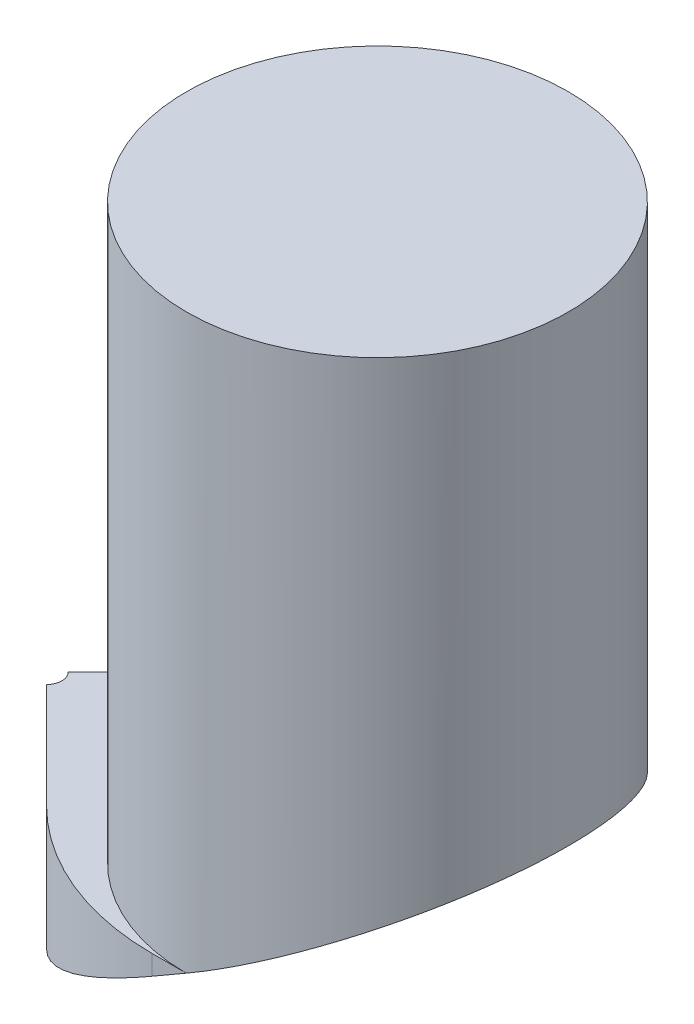
ISO-10303-21;
HEADER;
FILE_DESCRIPTION(('STEP AP214'),'2;1');
FILE_NAME('part.step','',(''),(''),'','','');
FILE_SCHEMA(('AUTOMOTIVE_DESIGN { 1 0 10303 214 1 1 1 1 }'));
ENDSEC;
DATA;
#1=APPLICATION_CONTEXT('core data for automotive mechanical design processes');
#2=APPLICATION_PROTOCOL_DEFINITION('international standard','automotive_design',2000,#1);
#3=PRODUCT_CONTEXT('',#1,'mechanical');
#4=PRODUCT('Part','Part','',(#3));
#5=PRODUCT_RELATED_PRODUCT_CATEGORY('part','',(#4));
#6=PRODUCT_DEFINITION_FORMATION('','',#4);
#7=PRODUCT_DEFINITION_CONTEXT('part definition',#1,'design');
#8=PRODUCT_DEFINITION('design','',#6,#7);
#9=PRODUCT_DEFINITION_SHAPE('','',#8);
#10=(LENGTH_UNIT() NAMED_UNIT(*) SI_UNIT(.MILLI.,.METRE.));
#11=(NAMED_UNIT(*) PLANE_ANGLE_UNIT() SI_UNIT($,.RADIAN.));
#12=(NAMED_UNIT(*) SI_UNIT($,.STERADIAN.) SOLID_ANGLE_UNIT());
#13=UNCERTAINTY_MEASURE_WITH_UNIT(LENGTH_MEASURE(1.E-05),#10,'distance_accuracy_value','');
#14=(GEOMETRIC_REPRESENTATION_CONTEXT(3) GLOBAL_UNCERTAINTY_ASSIGNED_CONTEXT((#13)) GLOBAL_UNIT_ASSIGNED_CONTEXT((#10,
#11,#12)) REPRESENTATION_CONTEXT('',''));
#15=CARTESIAN_POINT('',(0.,0.,0.));
#16=DIRECTION('',(0.,0.,1.));
#17=DIRECTION('',(1.,0.,0.));
#18=AXIS2_PLACEMENT_3D('',#15,#16,#17);
#19=CARTESIAN_POINT('',(0.,600.,0.));
#20=DIRECTION('',(0.,-1.,0.));
#21=DIRECTION('',(0.,0.,-1.));
#22=AXIS2_PLACEMENT_3D('',#19,#20,#21);
#23=CYLINDRICAL_SURFACE('',#22,12.);
#24=CARTESIAN_POINT('',(0.,150.,0.));
#25=DIRECTION('',(0.,1.,0.));
#26=DIRECTION('',(0.,0.,1.));
#27=AXIS2_PLACEMENT_3D('',#24,#25,#26);
#28=CIRCLE('',#27,12.);
#29=CARTESIAN_POINT('',(8.48528137423856,150.,-8.48528137423859));
#30=VERTEX_POINT('',#29);
#31=CARTESIAN_POINT('',(8.48528137423856,150.,8.48528137423859));
#32=VERTEX_POINT('',#31);
#33=EDGE_CURVE('E95',#30,#32,#28,.F.);
#34=ORIENTED_EDGE('',*,*,#33,.F.);
#35=DIRECTION('',(0.,-1.,0.));
#36=VECTOR('',#35,1.);
#37=CARTESIAN_POINT('',(8.48528137423855,600.,-8.48528137423859));
#38=LINE('',#37,#36);
#39=CARTESIAN_POINT('',(8.48528137423856,4.89897948556643,-8.48528137423858));
#40=VERTEX_POINT('',#39);
#41=EDGE_CURVE('E120',#30,#40,#38,.T.);
#42=ORIENTED_EDGE('',*,*,#41,.T.);
#43=CARTESIAN_POINT('',(0.,0.,0.));
#44=DIRECTION('',(-0.499999999999995,0.866025403784442,0.));
#45=DIRECTION('',(-0.866025403784442,-0.499999999999995,0.));
#46=AXIS2_PLACEMENT_3D('',#43,#44,#45);
#47=ELLIPSE('',#46,13.856406460551,12.);
#48=CARTESIAN_POINT('',(8.48528137423855,4.89897948556628,8.48528137423859));
#49=VERTEX_POINT('',#48);
#50=EDGE_CURVE('E118',#40,#49,#47,.F.);
#51=ORIENTED_EDGE('',*,*,#50,.T.);
#52=DIRECTION('',(0.,-1.,0.));
#53=VECTOR('',#52,1.);
#54=CARTESIAN_POINT('',(8.48528137423855,600.,8.48528137423859));
#55=LINE('',#54,#53);
#56=EDGE_CURVE('E110',#32,#49,#55,.T.);
#57=ORIENTED_EDGE('',*,*,#56,.F.);
#58=EDGE_LOOP('',(#34,#42,#51,#57));
#59=FACE_BOUND('',#58,.T.);
#60=ADVANCED_FACE('F37',(#59),#23,.F.);
#61=CARTESIAN_POINT('',(8.48528137423855,600.,8.48528137423859));
#62=DIRECTION('',(0.707106781186549,0.,-0.707106781186546));
#63=DIRECTION('',(-0.707106781186546,0.,-0.707106781186549));
#64=AXIS2_PLACEMENT_3D('',#61,#62,#63);
#65=PLANE('',#64);
#66=DIRECTION('',(0.654653670707977,0.377964473009222,0.65465367070798));
#67=VECTOR('',#66,1.);
#68=CARTESIAN_POINT('',(155.734596112392,89.9134109876261,155.734596112393));
#69=LINE('',#68,#67);
#70=CARTESIAN_POINT('',(91.4213562373089,52.7821446332903,91.4213562373092));
#71=VERTEX_POINT('',#70);
#72=EDGE_CURVE('E138',#49,#71,#69,.T.);
#73=ORIENTED_EDGE('',*,*,#72,.T.);
#74=DIRECTION('',(0.,-1.,0.));
#75=VECTOR('',#74,1.);
#76=CARTESIAN_POINT('',(91.4213562373089,600.,91.4213562373092));
#77=LINE('',#76,#75);
#78=CARTESIAN_POINT('',(91.4213562373089,150.,91.4213562373092));
#79=VERTEX_POINT('',#78);
#80=EDGE_CURVE('E113',#71,#79,#77,.F.);
#81=ORIENTED_EDGE('',*,*,#80,.T.);
#82=DIRECTION('',(0.707106781186546,0.,0.707106781186549));
#83=VECTOR('',#82,1.);
#84=CARTESIAN_POINT('',(0.,150.,0.));
#85=LINE('',#84,#83);
#86=EDGE_CURVE('E98',#32,#79,#85,.T.);
#87=ORIENTED_EDGE('',*,*,#86,.F.);
#88=ORIENTED_EDGE('',*,*,#56,.T.);
#89=EDGE_LOOP('',(#73,#81,#87,#88));
#90=FACE_BOUND('',#89,.T.);
#91=ADVANCED_FACE('F109',(#90),#65,.F.);
#92=CARTESIAN_POINT('',(149.999999999999,600.,150.));
#93=DIRECTION('',(0.,0.,-1.));
#94=DIRECTION('',(-1.,0.,0.));
#95=AXIS2_PLACEMENT_3D('',#92,#93,#94);
#96=PLANE('',#95);
#97=DIRECTION('',(1.,0.,0.));
#98=VECTOR('',#97,1.);
#99=CARTESIAN_POINT('',(149.999999999999,150.,150.));
#100=LINE('',#99,#98);
#101=CARTESIAN_POINT('',(232.842712474619,150.,150.));
#102=VERTEX_POINT('',#101);
#103=CARTESIAN_POINT('',(259.807621135335,150.,149.999938317262));
#104=VERTEX_POINT('',#103);
#105=EDGE_CURVE('E114',#102,#104,#100,.T.);
#106=ORIENTED_EDGE('',*,*,#105,.F.);
#107=DIRECTION('',(0.,-1.,0.));
#108=VECTOR('',#107,1.);
#109=CARTESIAN_POINT('',(232.842712474619,600.,150.));
#110=LINE('',#109,#108);
#111=CARTESIAN_POINT('',(232.842712474619,134.431802726062,150.));
#112=VERTEX_POINT('',#111);
#113=EDGE_CURVE('E122',#102,#112,#110,.T.);
#114=ORIENTED_EDGE('',*,*,#113,.T.);
#115=DIRECTION('',(-0.866025403784442,-0.499999999999995,0.));
#116=VECTOR('',#115,1.);
#117=CARTESIAN_POINT('',(0.,0.,150.));
#118=LINE('',#117,#116);
#119=EDGE_CURVE('E105',#104,#112,#118,.T.);
#120=ORIENTED_EDGE('',*,*,#119,.F.);
#121=EDGE_LOOP('',(#106,#114,#120));
#122=FACE_BOUND('',#121,.T.);
#123=ADVANCED_FACE('F186',(#122),#96,.F.);
#124=CARTESIAN_POINT('',(149.999999999999,600.,-150.));
#125=DIRECTION('',(0.,0.,1.));
#126=DIRECTION('',(1.,0.,0.));
#127=AXIS2_PLACEMENT_3D('',#124,#125,#126);
#128=PLANE('',#127);
#129=DIRECTION('',(-0.866025403784442,-0.499999999999995,0.));
#130=VECTOR('',#129,1.);
#131=CARTESIAN_POINT('',(0.,0.,-150.));
#132=LINE('',#131,#130);
#133=CARTESIAN_POINT('',(259.807621135335,150.,-149.999938317262));
#134=VERTEX_POINT('',#133);
#135=CARTESIAN_POINT('',(232.842712474619,134.431802726062,-150.));
#136=VERTEX_POINT('',#135);
#137=EDGE_CURVE('E128',#134,#136,#132,.T.);
#138=ORIENTED_EDGE('',*,*,#137,.T.);
#139=DIRECTION('',(0.,-1.,0.));
#140=VECTOR('',#139,1.);
#141=CARTESIAN_POINT('',(232.842712474619,600.,-150.));
#142=LINE('',#141,#140);
#143=CARTESIAN_POINT('',(232.842712474619,150.,-150.));
#144=VERTEX_POINT('',#143);
#145=EDGE_CURVE('E11',#136,#144,#142,.F.);
#146=ORIENTED_EDGE('',*,*,#145,.T.);
#147=DIRECTION('',(-1.,0.,0.));
#148=VECTOR('',#147,1.);
#149=CARTESIAN_POINT('',(149.999999999999,150.,-150.));
#150=LINE('',#149,#148);
#151=EDGE_CURVE('E161',#134,#144,#150,.T.);
#152=ORIENTED_EDGE('',*,*,#151,.F.);
#153=EDGE_LOOP('',(#138,#146,#152));
#154=FACE_BOUND('',#153,.T.);
#155=ADVANCED_FACE('F197',(#154),#128,.F.);
#156=CARTESIAN_POINT('',(8.48528137423855,600.,-8.48528137423859));
#157=DIRECTION('',(0.707106781186549,0.,0.707106781186546));
#158=DIRECTION('',(0.707106781186546,0.,-0.707106781186549));
#159=AXIS2_PLACEMENT_3D('',#156,#157,#158);
#160=PLANE('',#159);
#161=DIRECTION('',(-0.707106781186546,0.,0.707106781186549));
#162=VECTOR('',#161,1.);
#163=CARTESIAN_POINT('',(0.,150.,0.));
#164=LINE('',#163,#162);
#165=CARTESIAN_POINT('',(91.4213562373089,150.,-91.4213562373092));
#166=VERTEX_POINT('',#165);
#167=EDGE_CURVE('E100',#166,#30,#164,.T.);
#168=ORIENTED_EDGE('',*,*,#167,.F.);
#169=DIRECTION('',(0.,-1.,0.));
#170=VECTOR('',#169,1.);
#171=CARTESIAN_POINT('',(91.4213562373089,600.,-91.4213562373092));
#172=LINE('',#171,#170);
#173=CARTESIAN_POINT('',(91.4213562373089,52.7821446332903,-91.4213562373092));
#174=VERTEX_POINT('',#173);
#175=EDGE_CURVE('E45',#166,#174,#172,.T.);
#176=ORIENTED_EDGE('',*,*,#175,.T.);
#177=DIRECTION('',(-0.654653670707977,-0.377964473009222,0.65465367070798));
#178=VECTOR('',#177,1.);
#179=CARTESIAN_POINT('',(155.734596112392,89.9134109876261,-155.734596112393));
#180=LINE('',#179,#178);
#181=EDGE_CURVE('E119',#174,#40,#180,.T.);
#182=ORIENTED_EDGE('',*,*,#181,.T.);
#183=ORIENTED_EDGE('',*,*,#41,.F.);
#184=EDGE_LOOP('',(#168,#176,#182,#183));
#185=FACE_BOUND('',#184,.T.);
#186=ADVANCED_FACE('F174',(#185),#160,.F.);
#187=CARTESIAN_POINT('',(260.,600.,0.));
#188=DIRECTION('',(0.,-1.,0.));
#189=DIRECTION('',(0.,0.,-1.));
#190=AXIS2_PLACEMENT_3D('',#187,#188,#189);
#191=CYLINDRICAL_SURFACE('',#190,150.);
#192=CARTESIAN_POINT('',(260.,150.,0.));
#193=DIRECTION('',(0.,-1.,0.));
#194=DIRECTION('',(0.,0.,1.));
#195=AXIS2_PLACEMENT_3D('',#192,#193,#194);
#196=CIRCLE('',#195,150.);
#197=EDGE_CURVE('E152',#104,#134,#196,.T.);
#198=ORIENTED_EDGE('',*,*,#197,.F.);
#199=CARTESIAN_POINT('',(260.,150.111069989301,0.));
#200=DIRECTION('',(-0.499999999999995,0.866025403784442,0.));
#201=DIRECTION('',(-0.866025403784442,-0.499999999999995,0.));
#202=AXIS2_PLACEMENT_3D('',#199,#200,#201);
#203=ELLIPSE('',#202,173.205080756887,150.);
#204=EDGE_CURVE('E139',#104,#134,#203,.T.);
#205=ORIENTED_EDGE('',*,*,#204,.T.);
#206=EDGE_LOOP('',(#198,#205));
#207=FACE_BOUND('',#206,.T.);
#208=CARTESIAN_POINT('',(260.,600.,0.));
#209=DIRECTION('',(0.,1.,0.));
#210=DIRECTION('',(0.,0.,1.));
#211=AXIS2_PLACEMENT_3D('',#208,#209,#210);
#212=CIRCLE('',#211,150.);
#213=CARTESIAN_POINT('',(260.,600.,150.));
#214=VERTEX_POINT('',#213);
#215=EDGE_CURVE('E124',#214,#214,#212,.T.);
#216=ORIENTED_EDGE('',*,*,#215,.F.);
#217=EDGE_LOOP('',(#216));
#218=FACE_BOUND('',#217,.T.);
#219=ADVANCED_FACE('F187',(#207,#218),#191,.T.);
#220=CARTESIAN_POINT('',(0.,600.,0.));
#221=DIRECTION('',(0.,1.,0.));
#222=DIRECTION('',(0.,0.,1.));
#223=AXIS2_PLACEMENT_3D('',#220,#221,#222);
#224=PLANE('',#223);
#225=ORIENTED_EDGE('',*,*,#215,.T.);
#226=EDGE_LOOP('',(#225));
#227=FACE_BOUND('',#226,.T.);
#228=ADVANCED_FACE('F190',(#227),#224,.T.);
#229=CARTESIAN_POINT('',(0.,0.,-150.));
#230=DIRECTION('',(-0.499999999999995,0.866025403784442,0.));
#231=DIRECTION('',(-0.866025403784442,-0.499999999999995,0.));
#232=AXIS2_PLACEMENT_3D('',#229,#230,#231);
#233=PLANE('',#232);
#234=ORIENTED_EDGE('',*,*,#119,.T.);
#235=CARTESIAN_POINT('',(232.842712474619,134.431802726062,-50.));
#236=DIRECTION('',(-0.499999999999995,0.866025403784442,0.));
#237=DIRECTION('',(-0.866025403784442,-0.499999999999995,0.));
#238=AXIS2_PLACEMENT_3D('',#235,#236,#237);
#239=ELLIPSE('',#238,230.94010767585,200.);
#240=EDGE_CURVE('E169',#112,#71,#239,.F.);
#241=ORIENTED_EDGE('',*,*,#240,.T.);
#242=ORIENTED_EDGE('',*,*,#72,.F.);
#243=ORIENTED_EDGE('',*,*,#50,.F.);
#244=ORIENTED_EDGE('',*,*,#181,.F.);
#245=CARTESIAN_POINT('',(232.842712474619,134.431802726062,50.));
#246=DIRECTION('',(-0.499999999999995,0.866025403784442,0.));
#247=DIRECTION('',(-0.866025403784442,-0.499999999999995,0.));
#248=AXIS2_PLACEMENT_3D('',#245,#246,#247);
#249=ELLIPSE('',#248,230.94010767585,200.);
#250=EDGE_CURVE('E178',#174,#136,#249,.F.);
#251=ORIENTED_EDGE('',*,*,#250,.T.);
#252=ORIENTED_EDGE('',*,*,#137,.F.);
#253=ORIENTED_EDGE('',*,*,#204,.F.);
#254=EDGE_LOOP('',(#234,#241,#242,#243,#244,#251,#252,#253));
#255=FACE_BOUND('',#254,.T.);
#256=ADVANCED_FACE('F177',(#255),#233,.F.);
#257=CARTESIAN_POINT('',(260.,150.,0.));
#258=DIRECTION('',(0.,1.,0.));
#259=DIRECTION('',(0.,0.,1.));
#260=AXIS2_PLACEMENT_3D('',#257,#258,#259);
#261=PLANE('',#260);
#262=ORIENTED_EDGE('',*,*,#86,.T.);
#263=CARTESIAN_POINT('',(232.842712474619,150.,-50.));
#264=DIRECTION('',(0.,1.,0.));
#265=DIRECTION('',(0.,0.,1.));
#266=AXIS2_PLACEMENT_3D('',#263,#264,#265);
#267=CIRCLE('',#266,200.);
#268=EDGE_CURVE('E166',#79,#102,#267,.T.);
#269=ORIENTED_EDGE('',*,*,#268,.T.);
#270=ORIENTED_EDGE('',*,*,#105,.T.);
#271=ORIENTED_EDGE('',*,*,#197,.T.);
#272=ORIENTED_EDGE('',*,*,#151,.T.);
#273=CARTESIAN_POINT('',(232.842712474619,150.,50.));
#274=DIRECTION('',(0.,1.,0.));
#275=DIRECTION('',(0.,0.,1.));
#276=AXIS2_PLACEMENT_3D('',#273,#274,#275);
#277=CIRCLE('',#276,200.);
#278=EDGE_CURVE('E52',#144,#166,#277,.T.);
#279=ORIENTED_EDGE('',*,*,#278,.T.);
#280=ORIENTED_EDGE('',*,*,#167,.T.);
#281=ORIENTED_EDGE('',*,*,#33,.T.);
#282=EDGE_LOOP('',(#262,#269,#270,#271,#272,#279,#280,#281));
#283=FACE_BOUND('',#282,.T.);
#284=ADVANCED_FACE('F97',(#283),#261,.T.);
#285=CARTESIAN_POINT('',(232.842712474619,600.,-50.));
#286=DIRECTION('',(0.,-1.,0.));
#287=DIRECTION('',(0.,0.,-1.));
#288=AXIS2_PLACEMENT_3D('',#285,#286,#287);
#289=CYLINDRICAL_SURFACE('',#288,200.);
#290=ORIENTED_EDGE('',*,*,#268,.F.);
#291=ORIENTED_EDGE('',*,*,#80,.F.);
#292=ORIENTED_EDGE('',*,*,#240,.F.);
#293=ORIENTED_EDGE('',*,*,#113,.F.);
#294=EDGE_LOOP('',(#290,#291,#292,#293));
#295=FACE_BOUND('',#294,.T.);
#296=ADVANCED_FACE('F180',(#295),#289,.T.);
#297=CARTESIAN_POINT('',(232.842712474619,600.,50.));
#298=DIRECTION('',(0.,-1.,0.));
#299=DIRECTION('',(0.,0.,-1.));
#300=AXIS2_PLACEMENT_3D('',#297,#298,#299);
#301=CYLINDRICAL_SURFACE('',#300,200.);
#302=ORIENTED_EDGE('',*,*,#278,.F.);
#303=ORIENTED_EDGE('',*,*,#145,.F.);
#304=ORIENTED_EDGE('',*,*,#250,.F.);
#305=ORIENTED_EDGE('',*,*,#175,.F.);
#306=EDGE_LOOP('',(#302,#303,#304,#305));
#307=FACE_BOUND('',#306,.T.);
#308=ADVANCED_FACE('F39',(#307),#301,.T.);
#309=CLOSED_SHELL('',(#60,#91,#123,#155,#186,#219,#228,#256,#284,#296,#308));
#310=MANIFOLD_SOLID_BREP('B2',#309);
#311=ADVANCED_BREP_SHAPE_REPRESENTATION('',(#18,#310),#14);
#312=SHAPE_DEFINITION_REPRESENTATION(#9,#311);
ENDSEC;
END-ISO-10303-21;
